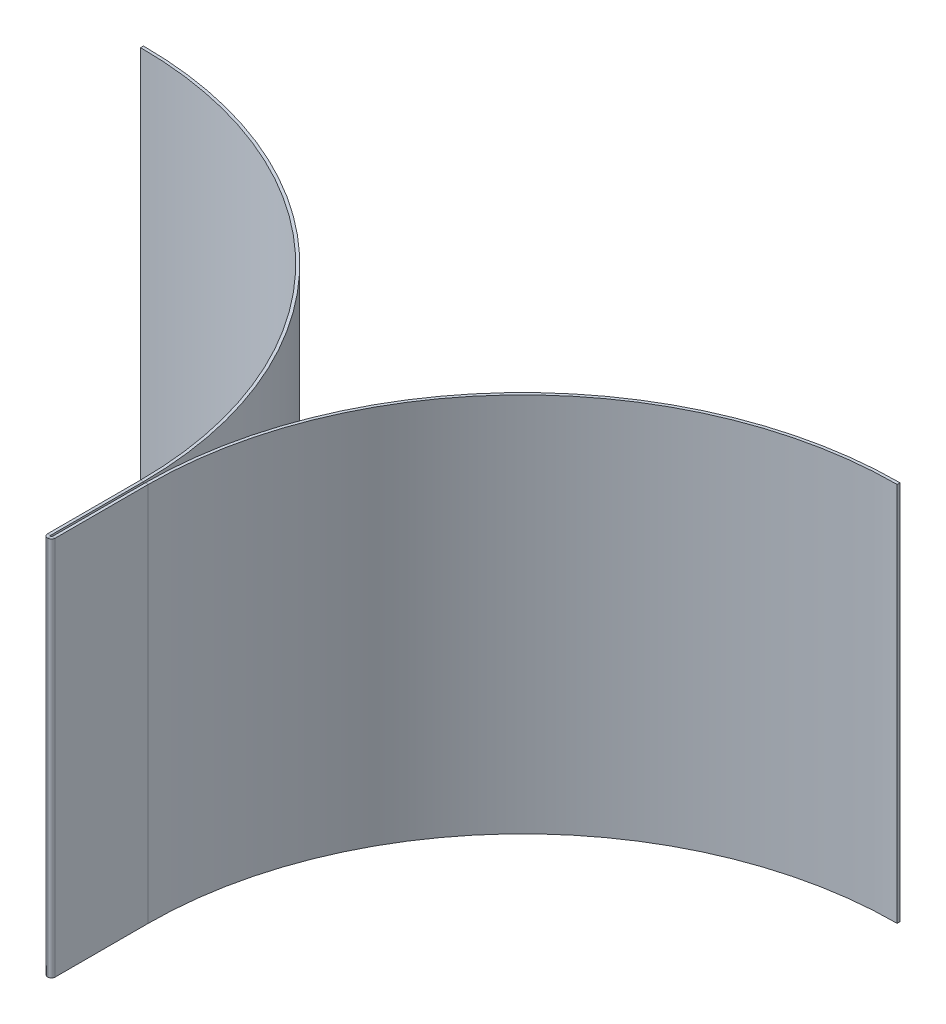
ISO-10303-21;
HEADER;
FILE_DESCRIPTION(('STEP AP214'),'2;1');
FILE_NAME('part.step','',(''),(''),'','','');
FILE_SCHEMA(('AUTOMOTIVE_DESIGN { 1 0 10303 214 1 1 1 1 }'));
ENDSEC;
DATA;
#1=APPLICATION_CONTEXT('core data for automotive mechanical design processes');
#2=APPLICATION_PROTOCOL_DEFINITION('international standard','automotive_design',2000,#1);
#3=PRODUCT_CONTEXT('',#1,'mechanical');
#4=PRODUCT('Part','Part','',(#3));
#5=PRODUCT_RELATED_PRODUCT_CATEGORY('part','',(#4));
#6=PRODUCT_DEFINITION_FORMATION('','',#4);
#7=PRODUCT_DEFINITION_CONTEXT('part definition',#1,'design');
#8=PRODUCT_DEFINITION('design','',#6,#7);
#9=PRODUCT_DEFINITION_SHAPE('','',#8);
#10=(LENGTH_UNIT() NAMED_UNIT(*) SI_UNIT(.MILLI.,.METRE.));
#11=(NAMED_UNIT(*) PLANE_ANGLE_UNIT() SI_UNIT($,.RADIAN.));
#12=(NAMED_UNIT(*) SI_UNIT($,.STERADIAN.) SOLID_ANGLE_UNIT());
#13=UNCERTAINTY_MEASURE_WITH_UNIT(LENGTH_MEASURE(1.E-05),#10,'distance_accuracy_value','');
#14=(GEOMETRIC_REPRESENTATION_CONTEXT(3) GLOBAL_UNCERTAINTY_ASSIGNED_CONTEXT((#13)) GLOBAL_UNIT_ASSIGNED_CONTEXT((#10,
#11,#12)) REPRESENTATION_CONTEXT('',''));
#15=CARTESIAN_POINT('',(0.,0.,0.));
#16=DIRECTION('',(0.,0.,1.));
#17=DIRECTION('',(1.,0.,0.));
#18=AXIS2_PLACEMENT_3D('',#15,#16,#17);
#19=CARTESIAN_POINT('',(198.5,200.,0.));
#20=DIRECTION('',(0.,1.,0.));
#21=DIRECTION('',(0.,0.,1.));
#22=AXIS2_PLACEMENT_3D('',#19,#20,#21);
#23=PLANE('',#22);
#24=DIRECTION('',(-1.,0.,0.));
#25=VECTOR('',#24,1.);
#26=CARTESIAN_POINT('',(198.5,200.,0.));
#27=LINE('',#26,#25);
#28=CARTESIAN_POINT('',(198.5,200.,0.));
#29=VERTEX_POINT('',#28);
#30=CARTESIAN_POINT('',(197.,200.,0.));
#31=VERTEX_POINT('',#30);
#32=EDGE_CURVE('E11',#29,#31,#27,.T.);
#33=ORIENTED_EDGE('',*,*,#32,.F.);
#34=CARTESIAN_POINT('',(0.,200.,0.));
#35=DIRECTION('',(0.,1.,0.));
#36=DIRECTION('',(1.,0.,0.));
#37=AXIS2_PLACEMENT_3D('',#34,#35,#36);
#38=CIRCLE('',#37,198.5);
#39=CARTESIAN_POINT('',(0.,200.,-198.5));
#40=VERTEX_POINT('',#39);
#41=EDGE_CURVE('E116',#29,#40,#38,.T.);
#42=ORIENTED_EDGE('',*,*,#41,.T.);
#43=DIRECTION('',(0.,0.,-1.));
#44=VECTOR('',#43,1.);
#45=CARTESIAN_POINT('',(2.22044604925031E-13,200.,-197.));
#46=LINE('',#45,#44);
#47=CARTESIAN_POINT('',(2.22044604925031E-13,200.,-197.));
#48=VERTEX_POINT('',#47);
#49=EDGE_CURVE('E693',#48,#40,#46,.T.);
#50=ORIENTED_EDGE('',*,*,#49,.F.);
#51=CARTESIAN_POINT('',(0.,200.,0.));
#52=DIRECTION('',(0.,1.,0.));
#53=DIRECTION('',(0.,0.,1.));
#54=AXIS2_PLACEMENT_3D('',#51,#52,#53);
#55=CIRCLE('',#54,197.);
#56=EDGE_CURVE('E308',#31,#48,#55,.T.);
#57=ORIENTED_EDGE('',*,*,#56,.F.);
#58=EDGE_LOOP('',(#33,#42,#50,#57));
#59=FACE_BOUND('',#58,.T.);
#60=ADVANCED_FACE('F37',(#59),#23,.T.);
#61=CARTESIAN_POINT('',(197.,1.11022302462516E-13,0.));
#62=DIRECTION('',(0.,-1.,0.));
#63=DIRECTION('',(0.,0.,-1.));
#64=AXIS2_PLACEMENT_3D('',#61,#62,#63);
#65=PLANE('',#64);
#66=DIRECTION('',(1.,0.,0.));
#67=VECTOR('',#66,1.);
#68=CARTESIAN_POINT('',(197.,1.11022302462516E-13,0.));
#69=LINE('',#68,#67);
#70=CARTESIAN_POINT('',(197.,1.11022302462516E-13,0.));
#71=VERTEX_POINT('',#70);
#72=CARTESIAN_POINT('',(198.5,0.,0.));
#73=VERTEX_POINT('',#72);
#74=EDGE_CURVE('E45',#71,#73,#69,.T.);
#75=ORIENTED_EDGE('',*,*,#74,.F.);
#76=CARTESIAN_POINT('',(0.,0.,0.));
#77=DIRECTION('',(0.,1.,0.));
#78=DIRECTION('',(0.,0.,1.));
#79=AXIS2_PLACEMENT_3D('',#76,#77,#78);
#80=CIRCLE('',#79,197.);
#81=CARTESIAN_POINT('',(0.,0.,-197.));
#82=VERTEX_POINT('',#81);
#83=EDGE_CURVE('E206',#71,#82,#80,.T.);
#84=ORIENTED_EDGE('',*,*,#83,.T.);
#85=DIRECTION('',(0.,0.,-1.));
#86=VECTOR('',#85,1.);
#87=CARTESIAN_POINT('',(0.,0.,-197.));
#88=LINE('',#87,#86);
#89=CARTESIAN_POINT('',(0.,0.,-198.5));
#90=VERTEX_POINT('',#89);
#91=EDGE_CURVE('E203',#82,#90,#88,.T.);
#92=ORIENTED_EDGE('',*,*,#91,.T.);
#93=CARTESIAN_POINT('',(0.,0.,0.));
#94=DIRECTION('',(0.,1.,0.));
#95=DIRECTION('',(1.,0.,0.));
#96=AXIS2_PLACEMENT_3D('',#93,#94,#95);
#97=CIRCLE('',#96,198.5);
#98=EDGE_CURVE('E200',#73,#90,#97,.T.);
#99=ORIENTED_EDGE('',*,*,#98,.F.);
#100=EDGE_LOOP('',(#75,#84,#92,#99));
#101=FACE_BOUND('',#100,.T.);
#102=ADVANCED_FACE('F392',(#101),#65,.T.);
#103=CARTESIAN_POINT('',(197.,200.,49.));
#104=DIRECTION('',(0.,1.,0.));
#105=DIRECTION('',(0.,0.,1.));
#106=AXIS2_PLACEMENT_3D('',#103,#104,#105);
#107=PLANE('',#106);
#108=DIRECTION('',(1.,0.,0.));
#109=VECTOR('',#108,1.);
#110=CARTESIAN_POINT('',(197.,200.,49.));
#111=LINE('',#110,#109);
#112=CARTESIAN_POINT('',(197.,200.,49.));
#113=VERTEX_POINT('',#112);
#114=CARTESIAN_POINT('',(198.5,200.,49.));
#115=VERTEX_POINT('',#114);
#116=EDGE_CURVE('E168',#113,#115,#111,.T.);
#117=ORIENTED_EDGE('',*,*,#116,.F.);
#118=CARTESIAN_POINT('',(198.9,200.,49.));
#119=DIRECTION('',(0.,-1.,0.));
#120=DIRECTION('',(0.,0.,-1.));
#121=AXIS2_PLACEMENT_3D('',#118,#119,#120);
#122=CIRCLE('',#121,1.90000000000001);
#123=CARTESIAN_POINT('',(198.9,200.,50.9));
#124=VERTEX_POINT('',#123);
#125=EDGE_CURVE('E163',#124,#113,#122,.T.);
#126=ORIENTED_EDGE('',*,*,#125,.F.);
#127=DIRECTION('',(0.,0.,1.));
#128=VECTOR('',#127,1.);
#129=CARTESIAN_POINT('',(198.9,200.,49.4000000000001));
#130=LINE('',#129,#128);
#131=CARTESIAN_POINT('',(198.9,200.,49.4000000000001));
#132=VERTEX_POINT('',#131);
#133=EDGE_CURVE('E156',#132,#124,#130,.T.);
#134=ORIENTED_EDGE('',*,*,#133,.F.);
#135=CARTESIAN_POINT('',(198.9,200.,49.));
#136=DIRECTION('',(0.,1.,0.));
#137=DIRECTION('',(1.,0.,0.));
#138=AXIS2_PLACEMENT_3D('',#135,#136,#137);
#139=CIRCLE('',#138,0.400000000000006);
#140=EDGE_CURVE('E160',#132,#115,#139,.F.);
#141=ORIENTED_EDGE('',*,*,#140,.T.);
#142=EDGE_LOOP('',(#117,#126,#134,#141));
#143=FACE_BOUND('',#142,.T.);
#144=ADVANCED_FACE('F158',(#143),#107,.T.);
#145=CARTESIAN_POINT('',(198.9,200.,49.4000000000001));
#146=DIRECTION('',(0.,1.,0.));
#147=DIRECTION('',(0.,0.,1.));
#148=AXIS2_PLACEMENT_3D('',#145,#146,#147);
#149=PLANE('',#148);
#150=DIRECTION('',(0.,0.,-1.));
#151=VECTOR('',#150,1.);
#152=CARTESIAN_POINT('',(197.,200.,0.));
#153=LINE('',#152,#151);
#154=EDGE_CURVE('E296',#113,#31,#153,.T.);
#155=ORIENTED_EDGE('',*,*,#154,.F.);
#156=ORIENTED_EDGE('',*,*,#116,.T.);
#157=DIRECTION('',(0.,0.,-1.));
#158=VECTOR('',#157,1.);
#159=CARTESIAN_POINT('',(198.5,200.,0.));
#160=LINE('',#159,#158);
#161=EDGE_CURVE('E194',#115,#29,#160,.T.);
#162=ORIENTED_EDGE('',*,*,#161,.T.);
#163=ORIENTED_EDGE('',*,*,#32,.T.);
#164=EDGE_LOOP('',(#155,#156,#162,#163));
#165=FACE_BOUND('',#164,.T.);
#166=ADVANCED_FACE('F293',(#165),#149,.T.);
#167=CARTESIAN_POINT('',(198.9,0.,50.9));
#168=DIRECTION('',(0.,-1.,0.));
#169=DIRECTION('',(0.,0.,-1.));
#170=AXIS2_PLACEMENT_3D('',#167,#168,#169);
#171=PLANE('',#170);
#172=DIRECTION('',(0.,0.,-1.));
#173=VECTOR('',#172,1.);
#174=CARTESIAN_POINT('',(198.9,0.,50.9));
#175=LINE('',#174,#173);
#176=CARTESIAN_POINT('',(198.9,0.,50.9));
#177=VERTEX_POINT('',#176);
#178=CARTESIAN_POINT('',(198.9,0.,49.4000000000001));
#179=VERTEX_POINT('',#178);
#180=EDGE_CURVE('E169',#177,#179,#175,.T.);
#181=ORIENTED_EDGE('',*,*,#180,.F.);
#182=CARTESIAN_POINT('',(198.9,0.,49.));
#183=DIRECTION('',(0.,-1.,0.));
#184=DIRECTION('',(0.,0.,-1.));
#185=AXIS2_PLACEMENT_3D('',#182,#183,#184);
#186=CIRCLE('',#185,1.90000000000001);
#187=CARTESIAN_POINT('',(197.,0.,49.));
#188=VERTEX_POINT('',#187);
#189=EDGE_CURVE('E211',#177,#188,#186,.T.);
#190=ORIENTED_EDGE('',*,*,#189,.T.);
#191=DIRECTION('',(-1.,0.,0.));
#192=VECTOR('',#191,1.);
#193=CARTESIAN_POINT('',(198.5,0.,49.));
#194=LINE('',#193,#192);
#195=CARTESIAN_POINT('',(198.5,0.,49.));
#196=VERTEX_POINT('',#195);
#197=EDGE_CURVE('E104',#196,#188,#194,.T.);
#198=ORIENTED_EDGE('',*,*,#197,.F.);
#199=CARTESIAN_POINT('',(198.9,0.,49.));
#200=DIRECTION('',(0.,1.,0.));
#201=DIRECTION('',(1.,0.,0.));
#202=AXIS2_PLACEMENT_3D('',#199,#200,#201);
#203=CIRCLE('',#202,0.400000000000006);
#204=EDGE_CURVE('E238',#179,#196,#203,.F.);
#205=ORIENTED_EDGE('',*,*,#204,.F.);
#206=EDGE_LOOP('',(#181,#190,#198,#205));
#207=FACE_BOUND('',#206,.T.);
#208=ADVANCED_FACE('F340',(#207),#171,.T.);
#209=CARTESIAN_POINT('',(198.5,0.,49.));
#210=DIRECTION('',(0.,-1.,0.));
#211=DIRECTION('',(0.,0.,-1.));
#212=AXIS2_PLACEMENT_3D('',#209,#210,#211);
#213=PLANE('',#212);
#214=DIRECTION('',(-1.,0.,0.));
#215=VECTOR('',#214,1.);
#216=CARTESIAN_POINT('',(199.1,0.,50.9));
#217=LINE('',#216,#215);
#218=CARTESIAN_POINT('',(199.1,0.,50.9));
#219=VERTEX_POINT('',#218);
#220=EDGE_CURVE('E213',#219,#177,#217,.T.);
#221=ORIENTED_EDGE('',*,*,#220,.T.);
#222=ORIENTED_EDGE('',*,*,#180,.T.);
#223=DIRECTION('',(-1.,0.,0.));
#224=VECTOR('',#223,1.);
#225=CARTESIAN_POINT('',(199.1,0.,49.4000000000001));
#226=LINE('',#225,#224);
#227=CARTESIAN_POINT('',(199.1,0.,49.4000000000001));
#228=VERTEX_POINT('',#227);
#229=EDGE_CURVE('E186',#228,#179,#226,.T.);
#230=ORIENTED_EDGE('',*,*,#229,.F.);
#231=DIRECTION('',(0.,0.,1.));
#232=VECTOR('',#231,1.);
#233=CARTESIAN_POINT('',(199.1,0.,49.4000000000001));
#234=LINE('',#233,#232);
#235=EDGE_CURVE('E282',#228,#219,#234,.T.);
#236=ORIENTED_EDGE('',*,*,#235,.T.);
#237=EDGE_LOOP('',(#221,#222,#230,#236));
#238=FACE_BOUND('',#237,.T.);
#239=ADVANCED_FACE('F338',(#238),#213,.T.);
#240=CARTESIAN_POINT('',(199.1,200.,50.9));
#241=DIRECTION('',(0.,1.,0.));
#242=DIRECTION('',(0.,0.,1.));
#243=AXIS2_PLACEMENT_3D('',#240,#241,#242);
#244=PLANE('',#243);
#245=DIRECTION('',(0.,0.,-1.));
#246=VECTOR('',#245,1.);
#247=CARTESIAN_POINT('',(199.1,200.,50.9));
#248=LINE('',#247,#246);
#249=CARTESIAN_POINT('',(199.1,200.,50.9));
#250=VERTEX_POINT('',#249);
#251=CARTESIAN_POINT('',(199.1,200.,49.4000000000001));
#252=VERTEX_POINT('',#251);
#253=EDGE_CURVE('E175',#250,#252,#248,.T.);
#254=ORIENTED_EDGE('',*,*,#253,.F.);
#255=CARTESIAN_POINT('',(199.1,200.,49.));
#256=DIRECTION('',(0.,-1.,0.));
#257=DIRECTION('',(0.,0.,1.));
#258=AXIS2_PLACEMENT_3D('',#255,#256,#257);
#259=CIRCLE('',#258,1.89999999999999);
#260=CARTESIAN_POINT('',(201.,200.,49.));
#261=VERTEX_POINT('',#260);
#262=EDGE_CURVE('E306',#261,#250,#259,.T.);
#263=ORIENTED_EDGE('',*,*,#262,.F.);
#264=DIRECTION('',(1.,0.,0.));
#265=VECTOR('',#264,1.);
#266=CARTESIAN_POINT('',(199.5,200.,49.));
#267=LINE('',#266,#265);
#268=CARTESIAN_POINT('',(199.5,200.,49.));
#269=VERTEX_POINT('',#268);
#270=EDGE_CURVE('E286',#269,#261,#267,.T.);
#271=ORIENTED_EDGE('',*,*,#270,.F.);
#272=CARTESIAN_POINT('',(199.1,200.,49.));
#273=DIRECTION('',(0.,1.,0.));
#274=DIRECTION('',(1.,0.,0.));
#275=AXIS2_PLACEMENT_3D('',#272,#273,#274);
#276=CIRCLE('',#275,0.399999999999985);
#277=EDGE_CURVE('E179',#269,#252,#276,.F.);
#278=ORIENTED_EDGE('',*,*,#277,.T.);
#279=EDGE_LOOP('',(#254,#263,#271,#278));
#280=FACE_BOUND('',#279,.T.);
#281=ADVANCED_FACE('F331',(#280),#244,.T.);
#282=CARTESIAN_POINT('',(199.5,200.,49.));
#283=DIRECTION('',(0.,1.,0.));
#284=DIRECTION('',(0.,0.,1.));
#285=AXIS2_PLACEMENT_3D('',#282,#283,#284);
#286=PLANE('',#285);
#287=DIRECTION('',(-1.,0.,0.));
#288=VECTOR('',#287,1.);
#289=CARTESIAN_POINT('',(199.1,200.,50.9));
#290=LINE('',#289,#288);
#291=EDGE_CURVE('E304',#250,#124,#290,.T.);
#292=ORIENTED_EDGE('',*,*,#291,.F.);
#293=ORIENTED_EDGE('',*,*,#253,.T.);
#294=DIRECTION('',(-1.,0.,0.));
#295=VECTOR('',#294,1.);
#296=CARTESIAN_POINT('',(199.1,200.,49.4000000000001));
#297=LINE('',#296,#295);
#298=EDGE_CURVE('E172',#252,#132,#297,.T.);
#299=ORIENTED_EDGE('',*,*,#298,.T.);
#300=ORIENTED_EDGE('',*,*,#133,.T.);
#301=EDGE_LOOP('',(#292,#293,#299,#300));
#302=FACE_BOUND('',#301,.T.);
#303=ADVANCED_FACE('F174',(#302),#286,.T.);
#304=CARTESIAN_POINT('',(201.,0.,49.));
#305=DIRECTION('',(0.,-1.,0.));
#306=DIRECTION('',(0.,0.,-1.));
#307=AXIS2_PLACEMENT_3D('',#304,#305,#306);
#308=PLANE('',#307);
#309=DIRECTION('',(-1.,0.,0.));
#310=VECTOR('',#309,1.);
#311=CARTESIAN_POINT('',(201.,0.,49.));
#312=LINE('',#311,#310);
#313=CARTESIAN_POINT('',(201.,0.,49.));
#314=VERTEX_POINT('',#313);
#315=CARTESIAN_POINT('',(199.5,0.,49.));
#316=VERTEX_POINT('',#315);
#317=EDGE_CURVE('E284',#314,#316,#312,.T.);
#318=ORIENTED_EDGE('',*,*,#317,.F.);
#319=CARTESIAN_POINT('',(199.1,0.,49.));
#320=DIRECTION('',(0.,-1.,0.));
#321=DIRECTION('',(0.,0.,1.));
#322=AXIS2_PLACEMENT_3D('',#319,#320,#321);
#323=CIRCLE('',#322,1.89999999999999);
#324=EDGE_CURVE('E216',#314,#219,#323,.T.);
#325=ORIENTED_EDGE('',*,*,#324,.T.);
#326=ORIENTED_EDGE('',*,*,#235,.F.);
#327=CARTESIAN_POINT('',(199.1,0.,49.));
#328=DIRECTION('',(0.,1.,0.));
#329=DIRECTION('',(1.,0.,0.));
#330=AXIS2_PLACEMENT_3D('',#327,#328,#329);
#331=CIRCLE('',#330,0.399999999999985);
#332=EDGE_CURVE('E234',#316,#228,#331,.F.);
#333=ORIENTED_EDGE('',*,*,#332,.F.);
#334=EDGE_LOOP('',(#318,#325,#326,#333));
#335=FACE_BOUND('',#334,.T.);
#336=ADVANCED_FACE('F375',(#335),#308,.T.);
#337=CARTESIAN_POINT('',(199.1,0.,49.4000000000001));
#338=DIRECTION('',(0.,-1.,0.));
#339=DIRECTION('',(0.,0.,-1.));
#340=AXIS2_PLACEMENT_3D('',#337,#338,#339);
#341=PLANE('',#340);
#342=DIRECTION('',(0.,0.,1.));
#343=VECTOR('',#342,1.);
#344=CARTESIAN_POINT('',(201.,0.,0.));
#345=LINE('',#344,#343);
#346=CARTESIAN_POINT('',(201.,0.,0.));
#347=VERTEX_POINT('',#346);
#348=EDGE_CURVE('E219',#347,#314,#345,.T.);
#349=ORIENTED_EDGE('',*,*,#348,.T.);
#350=ORIENTED_EDGE('',*,*,#317,.T.);
#351=DIRECTION('',(0.,0.,-1.));
#352=VECTOR('',#351,1.);
#353=CARTESIAN_POINT('',(199.5,0.,0.));
#354=LINE('',#353,#352);
#355=CARTESIAN_POINT('',(199.5,0.,0.));
#356=VERTEX_POINT('',#355);
#357=EDGE_CURVE('E231',#356,#316,#354,.F.);
#358=ORIENTED_EDGE('',*,*,#357,.F.);
#359=DIRECTION('',(1.,0.,0.));
#360=VECTOR('',#359,1.);
#361=CARTESIAN_POINT('',(199.5,0.,0.));
#362=LINE('',#361,#360);
#363=EDGE_CURVE('E278',#356,#347,#362,.T.);
#364=ORIENTED_EDGE('',*,*,#363,.T.);
#365=EDGE_LOOP('',(#349,#350,#358,#364));
#366=FACE_BOUND('',#365,.T.);
#367=ADVANCED_FACE('F377',(#366),#341,.T.);
#368=CARTESIAN_POINT('',(201.,200.,0.));
#369=DIRECTION('',(0.,1.,0.));
#370=DIRECTION('',(0.,0.,1.));
#371=AXIS2_PLACEMENT_3D('',#368,#369,#370);
#372=PLANE('',#371);
#373=DIRECTION('',(-1.,0.,0.));
#374=VECTOR('',#373,1.);
#375=CARTESIAN_POINT('',(201.,200.,0.));
#376=LINE('',#375,#374);
#377=CARTESIAN_POINT('',(201.,200.,0.));
#378=VERTEX_POINT('',#377);
#379=CARTESIAN_POINT('',(199.5,200.,0.));
#380=VERTEX_POINT('',#379);
#381=EDGE_CURVE('E280',#378,#380,#376,.T.);
#382=ORIENTED_EDGE('',*,*,#381,.F.);
#383=CARTESIAN_POINT('',(398.,200.,0.));
#384=DIRECTION('',(0.,1.,0.));
#385=DIRECTION('',(0.,0.,1.));
#386=AXIS2_PLACEMENT_3D('',#383,#384,#385);
#387=CIRCLE('',#386,197.);
#388=CARTESIAN_POINT('',(398.,200.,-197.));
#389=VERTEX_POINT('',#388);
#390=EDGE_CURVE('E317',#389,#378,#387,.T.);
#391=ORIENTED_EDGE('',*,*,#390,.F.);
#392=DIRECTION('',(0.,0.,1.));
#393=VECTOR('',#392,1.);
#394=CARTESIAN_POINT('',(398.,200.,-198.5));
#395=LINE('',#394,#393);
#396=CARTESIAN_POINT('',(398.,200.,-198.5));
#397=VERTEX_POINT('',#396);
#398=EDGE_CURVE('E320',#397,#389,#395,.T.);
#399=ORIENTED_EDGE('',*,*,#398,.F.);
#400=CARTESIAN_POINT('',(398.,200.,0.));
#401=DIRECTION('',(0.,1.,0.));
#402=DIRECTION('',(1.,0.,0.));
#403=AXIS2_PLACEMENT_3D('',#400,#401,#402);
#404=CIRCLE('',#403,198.5);
#405=EDGE_CURVE('E323',#397,#380,#404,.T.);
#406=ORIENTED_EDGE('',*,*,#405,.T.);
#407=EDGE_LOOP('',(#382,#391,#399,#406));
#408=FACE_BOUND('',#407,.T.);
#409=ADVANCED_FACE('F360',(#408),#372,.T.);
#410=CARTESIAN_POINT('',(199.5,0.,0.));
#411=DIRECTION('',(0.,-1.,0.));
#412=DIRECTION('',(0.,0.,-1.));
#413=AXIS2_PLACEMENT_3D('',#410,#411,#412);
#414=PLANE('',#413);
#415=ORIENTED_EDGE('',*,*,#363,.F.);
#416=CARTESIAN_POINT('',(398.,1.11022302462516E-13,0.));
#417=DIRECTION('',(0.,1.,0.));
#418=DIRECTION('',(1.,0.,0.));
#419=AXIS2_PLACEMENT_3D('',#416,#417,#418);
#420=CIRCLE('',#419,198.5);
#421=CARTESIAN_POINT('',(398.,1.11022302462516E-13,-198.5));
#422=VERTEX_POINT('',#421);
#423=EDGE_CURVE('E228',#422,#356,#420,.T.);
#424=ORIENTED_EDGE('',*,*,#423,.F.);
#425=DIRECTION('',(0.,0.,1.));
#426=VECTOR('',#425,1.);
#427=CARTESIAN_POINT('',(398.,1.11022302462516E-13,-198.5));
#428=LINE('',#427,#426);
#429=CARTESIAN_POINT('',(398.,1.11022302462516E-13,-197.));
#430=VERTEX_POINT('',#429);
#431=EDGE_CURVE('E225',#422,#430,#428,.T.);
#432=ORIENTED_EDGE('',*,*,#431,.T.);
#433=CARTESIAN_POINT('',(398.,1.11022302462516E-13,0.));
#434=DIRECTION('',(0.,1.,0.));
#435=DIRECTION('',(0.,0.,1.));
#436=AXIS2_PLACEMENT_3D('',#433,#434,#435);
#437=CIRCLE('',#436,197.);
#438=EDGE_CURVE('E222',#430,#347,#437,.T.);
#439=ORIENTED_EDGE('',*,*,#438,.T.);
#440=EDGE_LOOP('',(#415,#424,#432,#439));
#441=FACE_BOUND('',#440,.T.);
#442=ADVANCED_FACE('F379',(#441),#414,.T.);
#443=CARTESIAN_POINT('',(0.,200.,0.));
#444=DIRECTION('',(0.,-1.,0.));
#445=DIRECTION('',(0.,0.,-1.));
#446=AXIS2_PLACEMENT_3D('',#443,#444,#445);
#447=CYLINDRICAL_SURFACE('',#446,198.5);
#448=ORIENTED_EDGE('',*,*,#98,.T.);
#449=DIRECTION('',(0.,-1.,0.));
#450=VECTOR('',#449,1.);
#451=CARTESIAN_POINT('',(0.,200.,-198.5));
#452=LINE('',#451,#450);
#453=EDGE_CURVE('E276',#40,#90,#452,.T.);
#454=ORIENTED_EDGE('',*,*,#453,.F.);
#455=ORIENTED_EDGE('',*,*,#41,.F.);
#456=DIRECTION('',(0.,-1.,0.));
#457=VECTOR('',#456,1.);
#458=CARTESIAN_POINT('',(198.5,200.,0.));
#459=LINE('',#458,#457);
#460=EDGE_CURVE('E196',#29,#73,#459,.T.);
#461=ORIENTED_EDGE('',*,*,#460,.T.);
#462=EDGE_LOOP('',(#448,#454,#455,#461));
#463=FACE_BOUND('',#462,.T.);
#464=ADVANCED_FACE('F381',(#463),#447,.T.);
#465=CARTESIAN_POINT('',(2.22044604925031E-13,200.,-197.));
#466=DIRECTION('',(-1.,0.,0.));
#467=DIRECTION('',(0.,0.,1.));
#468=AXIS2_PLACEMENT_3D('',#465,#466,#467);
#469=PLANE('',#468);
#470=ORIENTED_EDGE('',*,*,#91,.F.);
#471=DIRECTION('',(0.,-1.,0.));
#472=VECTOR('',#471,1.);
#473=CARTESIAN_POINT('',(2.22044604925031E-13,200.,-197.));
#474=LINE('',#473,#472);
#475=EDGE_CURVE('E274',#48,#82,#474,.T.);
#476=ORIENTED_EDGE('',*,*,#475,.F.);
#477=ORIENTED_EDGE('',*,*,#49,.T.);
#478=ORIENTED_EDGE('',*,*,#453,.T.);
#479=EDGE_LOOP('',(#470,#476,#477,#478));
#480=FACE_BOUND('',#479,.T.);
#481=ADVANCED_FACE('F387',(#480),#469,.T.);
#482=CARTESIAN_POINT('',(0.,200.,0.));
#483=DIRECTION('',(0.,-1.,0.));
#484=DIRECTION('',(0.,0.,-1.));
#485=AXIS2_PLACEMENT_3D('',#482,#483,#484);
#486=CYLINDRICAL_SURFACE('',#485,197.);
#487=ORIENTED_EDGE('',*,*,#83,.F.);
#488=DIRECTION('',(0.,-1.,0.));
#489=VECTOR('',#488,1.);
#490=CARTESIAN_POINT('',(197.,200.,0.));
#491=LINE('',#490,#489);
#492=EDGE_CURVE('E271',#31,#71,#491,.T.);
#493=ORIENTED_EDGE('',*,*,#492,.F.);
#494=ORIENTED_EDGE('',*,*,#56,.T.);
#495=ORIENTED_EDGE('',*,*,#475,.T.);
#496=EDGE_LOOP('',(#487,#493,#494,#495));
#497=FACE_BOUND('',#496,.T.);
#498=ADVANCED_FACE('F445',(#497),#486,.F.);
#499=CARTESIAN_POINT('',(197.,200.,0.));
#500=DIRECTION('',(-1.,0.,0.));
#501=DIRECTION('',(0.,0.,1.));
#502=AXIS2_PLACEMENT_3D('',#499,#500,#501);
#503=PLANE('',#502);
#504=DIRECTION('',(0.,0.,-1.));
#505=VECTOR('',#504,1.);
#506=CARTESIAN_POINT('',(197.,1.11022302462516E-13,0.));
#507=LINE('',#506,#505);
#508=EDGE_CURVE('E209',#188,#71,#507,.T.);
#509=ORIENTED_EDGE('',*,*,#508,.F.);
#510=DIRECTION('',(0.,-1.,0.));
#511=VECTOR('',#510,1.);
#512=CARTESIAN_POINT('',(197.,200.,49.));
#513=LINE('',#512,#511);
#514=EDGE_CURVE('E268',#113,#188,#513,.T.);
#515=ORIENTED_EDGE('',*,*,#514,.F.);
#516=ORIENTED_EDGE('',*,*,#154,.T.);
#517=ORIENTED_EDGE('',*,*,#492,.T.);
#518=EDGE_LOOP('',(#509,#515,#516,#517));
#519=FACE_BOUND('',#518,.T.);
#520=ADVANCED_FACE('F300',(#519),#503,.T.);
#521=CARTESIAN_POINT('',(198.9,200.,49.));
#522=DIRECTION('',(0.,-1.,0.));
#523=DIRECTION('',(0.,0.,-1.));
#524=AXIS2_PLACEMENT_3D('',#521,#522,#523);
#525=CYLINDRICAL_SURFACE('',#524,1.90000000000001);
#526=ORIENTED_EDGE('',*,*,#189,.F.);
#527=DIRECTION('',(0.,-1.,0.));
#528=VECTOR('',#527,1.);
#529=CARTESIAN_POINT('',(198.9,200.,50.9));
#530=LINE('',#529,#528);
#531=EDGE_CURVE('E265',#124,#177,#530,.T.);
#532=ORIENTED_EDGE('',*,*,#531,.F.);
#533=ORIENTED_EDGE('',*,*,#125,.T.);
#534=ORIENTED_EDGE('',*,*,#514,.T.);
#535=EDGE_LOOP('',(#526,#532,#533,#534));
#536=FACE_BOUND('',#535,.T.);
#537=ADVANCED_FACE('F303',(#536),#525,.T.);
#538=CARTESIAN_POINT('',(199.1,200.,50.9));
#539=DIRECTION('',(0.,0.,1.));
#540=DIRECTION('',(1.,0.,0.));
#541=AXIS2_PLACEMENT_3D('',#538,#539,#540);
#542=PLANE('',#541);
#543=ORIENTED_EDGE('',*,*,#220,.F.);
#544=DIRECTION('',(0.,-1.,0.));
#545=VECTOR('',#544,1.);
#546=CARTESIAN_POINT('',(199.1,200.,50.9));
#547=LINE('',#546,#545);
#548=EDGE_CURVE('E262',#250,#219,#547,.T.);
#549=ORIENTED_EDGE('',*,*,#548,.F.);
#550=ORIENTED_EDGE('',*,*,#291,.T.);
#551=ORIENTED_EDGE('',*,*,#531,.T.);
#552=EDGE_LOOP('',(#543,#549,#550,#551));
#553=FACE_BOUND('',#552,.T.);
#554=ADVANCED_FACE('F342',(#553),#542,.T.);
#555=CARTESIAN_POINT('',(199.1,200.,49.));
#556=DIRECTION('',(0.,-1.,0.));
#557=DIRECTION('',(0.,0.,-1.));
#558=AXIS2_PLACEMENT_3D('',#555,#556,#557);
#559=CYLINDRICAL_SURFACE('',#558,1.89999999999999);
#560=ORIENTED_EDGE('',*,*,#324,.F.);
#561=DIRECTION('',(0.,-1.,0.));
#562=VECTOR('',#561,1.);
#563=CARTESIAN_POINT('',(201.,200.,49.));
#564=LINE('',#563,#562);
#565=EDGE_CURVE('E259',#261,#314,#564,.T.);
#566=ORIENTED_EDGE('',*,*,#565,.F.);
#567=ORIENTED_EDGE('',*,*,#262,.T.);
#568=ORIENTED_EDGE('',*,*,#548,.T.);
#569=EDGE_LOOP('',(#560,#566,#567,#568));
#570=FACE_BOUND('',#569,.T.);
#571=ADVANCED_FACE('F346',(#570),#559,.T.);
#572=CARTESIAN_POINT('',(201.,200.,0.));
#573=DIRECTION('',(1.,0.,0.));
#574=DIRECTION('',(0.,0.,-1.));
#575=AXIS2_PLACEMENT_3D('',#572,#573,#574);
#576=PLANE('',#575);
#577=ORIENTED_EDGE('',*,*,#348,.F.);
#578=DIRECTION('',(0.,-1.,0.));
#579=VECTOR('',#578,1.);
#580=CARTESIAN_POINT('',(201.,200.,0.));
#581=LINE('',#580,#579);
#582=EDGE_CURVE('E256',#378,#347,#581,.T.);
#583=ORIENTED_EDGE('',*,*,#582,.F.);
#584=DIRECTION('',(0.,0.,1.));
#585=VECTOR('',#584,1.);
#586=CARTESIAN_POINT('',(201.,200.,0.));
#587=LINE('',#586,#585);
#588=EDGE_CURVE('E314',#378,#261,#587,.T.);
#589=ORIENTED_EDGE('',*,*,#588,.T.);
#590=ORIENTED_EDGE('',*,*,#565,.T.);
#591=EDGE_LOOP('',(#577,#583,#589,#590));
#592=FACE_BOUND('',#591,.T.);
#593=ADVANCED_FACE('F351',(#592),#576,.T.);
#594=CARTESIAN_POINT('',(398.,200.,0.));
#595=DIRECTION('',(0.,-1.,0.));
#596=DIRECTION('',(0.,0.,-1.));
#597=AXIS2_PLACEMENT_3D('',#594,#595,#596);
#598=CYLINDRICAL_SURFACE('',#597,197.);
#599=ORIENTED_EDGE('',*,*,#438,.F.);
#600=DIRECTION('',(0.,-1.,0.));
#601=VECTOR('',#600,1.);
#602=CARTESIAN_POINT('',(398.,200.,-197.));
#603=LINE('',#602,#601);
#604=EDGE_CURVE('E254',#389,#430,#603,.T.);
#605=ORIENTED_EDGE('',*,*,#604,.F.);
#606=ORIENTED_EDGE('',*,*,#390,.T.);
#607=ORIENTED_EDGE('',*,*,#582,.T.);
#608=EDGE_LOOP('',(#599,#605,#606,#607));
#609=FACE_BOUND('',#608,.T.);
#610=ADVANCED_FACE('F357',(#609),#598,.F.);
#611=CARTESIAN_POINT('',(398.,200.,-198.5));
#612=DIRECTION('',(1.,0.,0.));
#613=DIRECTION('',(0.,0.,-1.));
#614=AXIS2_PLACEMENT_3D('',#611,#612,#613);
#615=PLANE('',#614);
#616=ORIENTED_EDGE('',*,*,#431,.F.);
#617=DIRECTION('',(0.,-1.,0.));
#618=VECTOR('',#617,1.);
#619=CARTESIAN_POINT('',(398.,200.,-198.5));
#620=LINE('',#619,#618);
#621=EDGE_CURVE('E252',#397,#422,#620,.T.);
#622=ORIENTED_EDGE('',*,*,#621,.F.);
#623=ORIENTED_EDGE('',*,*,#398,.T.);
#624=ORIENTED_EDGE('',*,*,#604,.T.);
#625=EDGE_LOOP('',(#616,#622,#623,#624));
#626=FACE_BOUND('',#625,.T.);
#627=ADVANCED_FACE('F363',(#626),#615,.T.);
#628=CARTESIAN_POINT('',(398.,200.,0.));
#629=DIRECTION('',(0.,-1.,0.));
#630=DIRECTION('',(0.,0.,-1.));
#631=AXIS2_PLACEMENT_3D('',#628,#629,#630);
#632=CYLINDRICAL_SURFACE('',#631,198.5);
#633=ORIENTED_EDGE('',*,*,#423,.T.);
#634=DIRECTION('',(0.,-1.,0.));
#635=VECTOR('',#634,1.);
#636=CARTESIAN_POINT('',(199.5,200.,0.));
#637=LINE('',#636,#635);
#638=EDGE_CURVE('E249',#380,#356,#637,.T.);
#639=ORIENTED_EDGE('',*,*,#638,.F.);
#640=ORIENTED_EDGE('',*,*,#405,.F.);
#641=ORIENTED_EDGE('',*,*,#621,.T.);
#642=EDGE_LOOP('',(#633,#639,#640,#641));
#643=FACE_BOUND('',#642,.T.);
#644=ADVANCED_FACE('F368',(#643),#632,.T.);
#645=CARTESIAN_POINT('',(199.5,200.,0.));
#646=DIRECTION('',(1.,0.,0.));
#647=DIRECTION('',(0.,0.,-1.));
#648=AXIS2_PLACEMENT_3D('',#645,#646,#647);
#649=PLANE('',#648);
#650=ORIENTED_EDGE('',*,*,#357,.T.);
#651=DIRECTION('',(0.,-1.,0.));
#652=VECTOR('',#651,1.);
#653=CARTESIAN_POINT('',(199.5,200.,49.));
#654=LINE('',#653,#652);
#655=EDGE_CURVE('E246',#269,#316,#654,.T.);
#656=ORIENTED_EDGE('',*,*,#655,.F.);
#657=DIRECTION('',(0.,0.,-1.));
#658=VECTOR('',#657,1.);
#659=CARTESIAN_POINT('',(199.5,200.,0.));
#660=LINE('',#659,#658);
#661=EDGE_CURVE('E326',#380,#269,#660,.F.);
#662=ORIENTED_EDGE('',*,*,#661,.F.);
#663=ORIENTED_EDGE('',*,*,#638,.T.);
#664=EDGE_LOOP('',(#650,#656,#662,#663));
#665=FACE_BOUND('',#664,.T.);
#666=ADVANCED_FACE('F373',(#665),#649,.F.);
#667=CARTESIAN_POINT('',(199.1,200.,49.));
#668=DIRECTION('',(0.,-1.,0.));
#669=DIRECTION('',(0.,0.,-1.));
#670=AXIS2_PLACEMENT_3D('',#667,#668,#669);
#671=CYLINDRICAL_SURFACE('',#670,0.399999999999985);
#672=ORIENTED_EDGE('',*,*,#332,.T.);
#673=DIRECTION('',(0.,-1.,0.));
#674=VECTOR('',#673,1.);
#675=CARTESIAN_POINT('',(199.1,200.,49.4000000000001));
#676=LINE('',#675,#674);
#677=EDGE_CURVE('E188',#252,#228,#676,.T.);
#678=ORIENTED_EDGE('',*,*,#677,.F.);
#679=ORIENTED_EDGE('',*,*,#277,.F.);
#680=ORIENTED_EDGE('',*,*,#655,.T.);
#681=EDGE_LOOP('',(#672,#678,#679,#680));
#682=FACE_BOUND('',#681,.T.);
#683=ADVANCED_FACE('F335',(#682),#671,.F.);
#684=CARTESIAN_POINT('',(199.1,200.,49.4000000000001));
#685=DIRECTION('',(0.,0.,1.));
#686=DIRECTION('',(1.,0.,0.));
#687=AXIS2_PLACEMENT_3D('',#684,#685,#686);
#688=PLANE('',#687);
#689=ORIENTED_EDGE('',*,*,#229,.T.);
#690=DIRECTION('',(0.,-1.,0.));
#691=VECTOR('',#690,1.);
#692=CARTESIAN_POINT('',(198.9,200.,49.4000000000001));
#693=LINE('',#692,#691);
#694=EDGE_CURVE('E183',#132,#179,#693,.T.);
#695=ORIENTED_EDGE('',*,*,#694,.F.);
#696=ORIENTED_EDGE('',*,*,#298,.F.);
#697=ORIENTED_EDGE('',*,*,#677,.T.);
#698=EDGE_LOOP('',(#689,#695,#696,#697));
#699=FACE_BOUND('',#698,.T.);
#700=ADVANCED_FACE('F184',(#699),#688,.F.);
#701=CARTESIAN_POINT('',(198.9,200.,49.));
#702=DIRECTION('',(0.,-1.,0.));
#703=DIRECTION('',(0.,0.,-1.));
#704=AXIS2_PLACEMENT_3D('',#701,#702,#703);
#705=CYLINDRICAL_SURFACE('',#704,0.400000000000006);
#706=ORIENTED_EDGE('',*,*,#204,.T.);
#707=DIRECTION('',(0.,-1.,0.));
#708=VECTOR('',#707,1.);
#709=CARTESIAN_POINT('',(198.5,200.,49.));
#710=LINE('',#709,#708);
#711=EDGE_CURVE('E189',#115,#196,#710,.T.);
#712=ORIENTED_EDGE('',*,*,#711,.F.);
#713=ORIENTED_EDGE('',*,*,#140,.F.);
#714=ORIENTED_EDGE('',*,*,#694,.T.);
#715=EDGE_LOOP('',(#706,#712,#713,#714));
#716=FACE_BOUND('',#715,.T.);
#717=ADVANCED_FACE('F191',(#716),#705,.F.);
#718=CARTESIAN_POINT('',(198.5,200.,0.));
#719=DIRECTION('',(-1.,0.,0.));
#720=DIRECTION('',(0.,0.,1.));
#721=AXIS2_PLACEMENT_3D('',#718,#719,#720);
#722=PLANE('',#721);
#723=DIRECTION('',(0.,0.,-1.));
#724=VECTOR('',#723,1.);
#725=CARTESIAN_POINT('',(198.5,0.,0.));
#726=LINE('',#725,#724);
#727=EDGE_CURVE('E240',#196,#73,#726,.T.);
#728=ORIENTED_EDGE('',*,*,#727,.T.);
#729=ORIENTED_EDGE('',*,*,#460,.F.);
#730=ORIENTED_EDGE('',*,*,#161,.F.);
#731=ORIENTED_EDGE('',*,*,#711,.T.);
#732=EDGE_LOOP('',(#728,#729,#730,#731));
#733=FACE_BOUND('',#732,.T.);
#734=ADVANCED_FACE('F565',(#733),#722,.F.);
#735=CARTESIAN_POINT('',(0.,200.,0.));
#736=DIRECTION('',(0.,1.,0.));
#737=DIRECTION('',(1.,0.,0.));
#738=AXIS2_PLACEMENT_3D('',#735,#736,#737);
#739=PLANE('',#738);
#740=ORIENTED_EDGE('',*,*,#661,.T.);
#741=ORIENTED_EDGE('',*,*,#270,.T.);
#742=ORIENTED_EDGE('',*,*,#588,.F.);
#743=ORIENTED_EDGE('',*,*,#381,.T.);
#744=EDGE_LOOP('',(#740,#741,#742,#743));
#745=FACE_BOUND('',#744,.T.);
#746=ADVANCED_FACE('F353',(#745),#739,.T.);
#747=CARTESIAN_POINT('',(0.,0.,0.));
#748=DIRECTION('',(0.,1.,0.));
#749=DIRECTION('',(1.,0.,0.));
#750=AXIS2_PLACEMENT_3D('',#747,#748,#749);
#751=PLANE('',#750);
#752=ORIENTED_EDGE('',*,*,#508,.T.);
#753=ORIENTED_EDGE('',*,*,#74,.T.);
#754=ORIENTED_EDGE('',*,*,#727,.F.);
#755=ORIENTED_EDGE('',*,*,#197,.T.);
#756=EDGE_LOOP('',(#752,#753,#754,#755));
#757=FACE_BOUND('',#756,.T.);
#758=ADVANCED_FACE('F585',(#757),#751,.F.);
#759=CLOSED_SHELL('',(#60,#102,#144,#166,#208,#239,#281,#303,#336,#367,#409,#442,#464,#481,#498,
#520,#537,#554,#571,#593,#610,#627,#644,#666,#683,#700,#717,#734,#746,#758));
#760=MANIFOLD_SOLID_BREP('B2',#759);
#761=ADVANCED_BREP_SHAPE_REPRESENTATION('',(#18,#760),#14);
#762=SHAPE_DEFINITION_REPRESENTATION(#9,#761);
ENDSEC;
END-ISO-10303-21;
